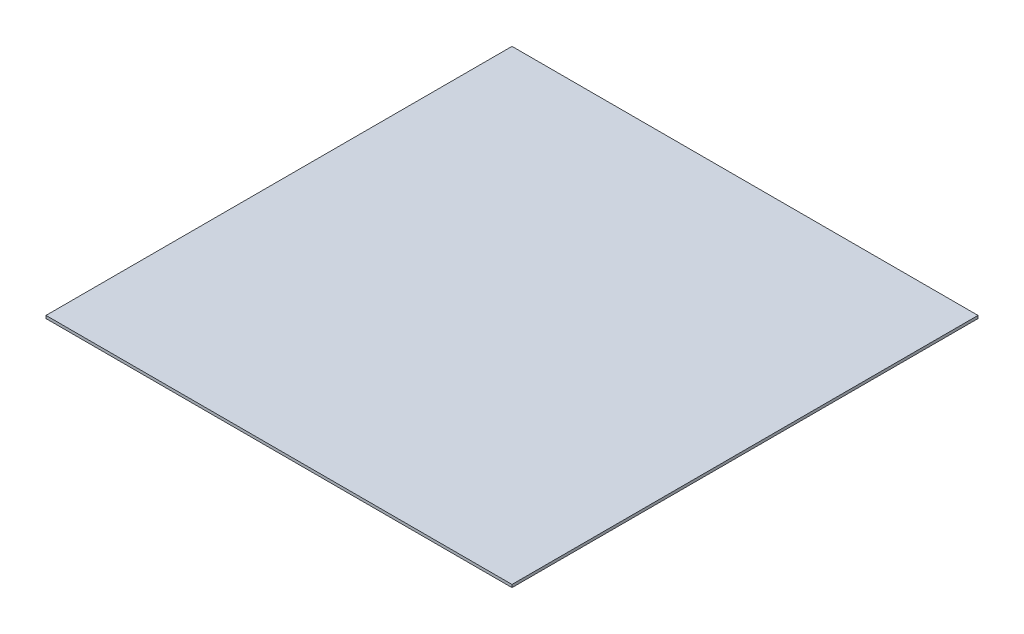
ISO-10303-21;
HEADER;
FILE_DESCRIPTION(('STEP AP214'),'2;1');
FILE_NAME('part.step','',(''),(''),'','','');
FILE_SCHEMA(('AUTOMOTIVE_DESIGN { 1 0 10303 214 1 1 1 1 }'));
ENDSEC;
DATA;
#1=APPLICATION_CONTEXT('core data for automotive mechanical design processes');
#2=APPLICATION_PROTOCOL_DEFINITION('international standard','automotive_design',2000,#1);
#3=PRODUCT_CONTEXT('',#1,'mechanical');
#4=PRODUCT('Part','Part','',(#3));
#5=PRODUCT_RELATED_PRODUCT_CATEGORY('part','',(#4));
#6=PRODUCT_DEFINITION_FORMATION('','',#4);
#7=PRODUCT_DEFINITION_CONTEXT('part definition',#1,'design');
#8=PRODUCT_DEFINITION('design','',#6,#7);
#9=PRODUCT_DEFINITION_SHAPE('','',#8);
#10=(LENGTH_UNIT() NAMED_UNIT(*) SI_UNIT(.MILLI.,.METRE.));
#11=(NAMED_UNIT(*) PLANE_ANGLE_UNIT() SI_UNIT($,.RADIAN.));
#12=(NAMED_UNIT(*) SI_UNIT($,.STERADIAN.) SOLID_ANGLE_UNIT());
#13=UNCERTAINTY_MEASURE_WITH_UNIT(LENGTH_MEASURE(1.E-05),#10,'distance_accuracy_value','');
#14=(GEOMETRIC_REPRESENTATION_CONTEXT(3) GLOBAL_UNCERTAINTY_ASSIGNED_CONTEXT((#13)) GLOBAL_UNIT_ASSIGNED_CONTEXT((#10,
#11,#12)) REPRESENTATION_CONTEXT('',''));
#15=CARTESIAN_POINT('',(0.,0.,0.));
#16=DIRECTION('',(0.,0.,1.));
#17=DIRECTION('',(1.,0.,0.));
#18=AXIS2_PLACEMENT_3D('',#15,#16,#17);
#19=CARTESIAN_POINT('',(150.,1.8,-150.));
#20=DIRECTION('',(-1.,0.,0.));
#21=DIRECTION('',(0.,0.,1.));
#22=AXIS2_PLACEMENT_3D('',#19,#20,#21);
#23=PLANE('',#22);
#24=DIRECTION('',(0.,0.,-1.));
#25=VECTOR('',#24,1.);
#26=CARTESIAN_POINT('',(150.,0.,-150.));
#27=LINE('',#26,#25);
#28=CARTESIAN_POINT('',(150.,0.,150.));
#29=VERTEX_POINT('',#28);
#30=CARTESIAN_POINT('',(150.,0.,-150.));
#31=VERTEX_POINT('',#30);
#32=EDGE_CURVE('E96',#29,#31,#27,.T.);
#33=ORIENTED_EDGE('',*,*,#32,.T.);
#34=DIRECTION('',(0.,-1.,0.));
#35=VECTOR('',#34,1.);
#36=CARTESIAN_POINT('',(150.,1.8,-150.));
#37=LINE('',#36,#35);
#38=CARTESIAN_POINT('',(150.,1.8,-150.));
#39=VERTEX_POINT('',#38);
#40=EDGE_CURVE('E11',#39,#31,#37,.T.);
#41=ORIENTED_EDGE('',*,*,#40,.F.);
#42=DIRECTION('',(0.,0.,-1.));
#43=VECTOR('',#42,1.);
#44=CARTESIAN_POINT('',(150.,1.8,-150.));
#45=LINE('',#44,#43);
#46=CARTESIAN_POINT('',(150.,1.8,150.));
#47=VERTEX_POINT('',#46);
#48=EDGE_CURVE('E84',#47,#39,#45,.T.);
#49=ORIENTED_EDGE('',*,*,#48,.F.);
#50=DIRECTION('',(0.,-1.,0.));
#51=VECTOR('',#50,1.);
#52=CARTESIAN_POINT('',(150.,1.8,150.));
#53=LINE('',#52,#51);
#54=EDGE_CURVE('E92',#47,#29,#53,.T.);
#55=ORIENTED_EDGE('',*,*,#54,.T.);
#56=EDGE_LOOP('',(#33,#41,#49,#55));
#57=FACE_BOUND('',#56,.T.);
#58=ADVANCED_FACE('F33',(#57),#23,.F.);
#59=CARTESIAN_POINT('',(-150.,1.8,-150.));
#60=DIRECTION('',(0.,0.,1.));
#61=DIRECTION('',(1.,0.,0.));
#62=AXIS2_PLACEMENT_3D('',#59,#60,#61);
#63=PLANE('',#62);
#64=DIRECTION('',(-1.,0.,0.));
#65=VECTOR('',#64,1.);
#66=CARTESIAN_POINT('',(-150.,0.,-150.));
#67=LINE('',#66,#65);
#68=CARTESIAN_POINT('',(-150.,0.,-150.));
#69=VERTEX_POINT('',#68);
#70=EDGE_CURVE('E88',#31,#69,#67,.T.);
#71=ORIENTED_EDGE('',*,*,#70,.T.);
#72=DIRECTION('',(0.,-1.,0.));
#73=VECTOR('',#72,1.);
#74=CARTESIAN_POINT('',(-150.,1.8,-150.));
#75=LINE('',#74,#73);
#76=CARTESIAN_POINT('',(-150.,1.8,-150.));
#77=VERTEX_POINT('',#76);
#78=EDGE_CURVE('E41',#77,#69,#75,.T.);
#79=ORIENTED_EDGE('',*,*,#78,.F.);
#80=DIRECTION('',(-1.,0.,0.));
#81=VECTOR('',#80,1.);
#82=CARTESIAN_POINT('',(-150.,1.8,-150.));
#83=LINE('',#82,#81);
#84=EDGE_CURVE('E79',#39,#77,#83,.T.);
#85=ORIENTED_EDGE('',*,*,#84,.F.);
#86=ORIENTED_EDGE('',*,*,#40,.T.);
#87=EDGE_LOOP('',(#71,#79,#85,#86));
#88=FACE_BOUND('',#87,.T.);
#89=ADVANCED_FACE('F87',(#88),#63,.F.);
#90=CARTESIAN_POINT('',(-150.,1.8,-150.));
#91=DIRECTION('',(1.,0.,0.));
#92=DIRECTION('',(0.,0.,-1.));
#93=AXIS2_PLACEMENT_3D('',#90,#91,#92);
#94=PLANE('',#93);
#95=DIRECTION('',(0.,0.,1.));
#96=VECTOR('',#95,1.);
#97=CARTESIAN_POINT('',(-150.,0.,-150.));
#98=LINE('',#97,#96);
#99=CARTESIAN_POINT('',(-150.,0.,150.));
#100=VERTEX_POINT('',#99);
#101=EDGE_CURVE('E66',#69,#100,#98,.T.);
#102=ORIENTED_EDGE('',*,*,#101,.T.);
#103=DIRECTION('',(0.,-1.,0.));
#104=VECTOR('',#103,1.);
#105=CARTESIAN_POINT('',(-150.,1.8,150.));
#106=LINE('',#105,#104);
#107=CARTESIAN_POINT('',(-150.,1.8,150.));
#108=VERTEX_POINT('',#107);
#109=EDGE_CURVE('E89',#108,#100,#106,.T.);
#110=ORIENTED_EDGE('',*,*,#109,.F.);
#111=DIRECTION('',(0.,0.,1.));
#112=VECTOR('',#111,1.);
#113=CARTESIAN_POINT('',(-150.,1.8,-150.));
#114=LINE('',#113,#112);
#115=EDGE_CURVE('E82',#77,#108,#114,.T.);
#116=ORIENTED_EDGE('',*,*,#115,.F.);
#117=ORIENTED_EDGE('',*,*,#78,.T.);
#118=EDGE_LOOP('',(#102,#110,#116,#117));
#119=FACE_BOUND('',#118,.T.);
#120=ADVANCED_FACE('F90',(#119),#94,.F.);
#121=CARTESIAN_POINT('',(-150.,1.8,150.));
#122=DIRECTION('',(0.,0.,-1.));
#123=DIRECTION('',(-1.,0.,0.));
#124=AXIS2_PLACEMENT_3D('',#121,#122,#123);
#125=PLANE('',#124);
#126=DIRECTION('',(1.,0.,0.));
#127=VECTOR('',#126,1.);
#128=CARTESIAN_POINT('',(-150.,0.,150.));
#129=LINE('',#128,#127);
#130=EDGE_CURVE('E72',#100,#29,#129,.T.);
#131=ORIENTED_EDGE('',*,*,#130,.T.);
#132=ORIENTED_EDGE('',*,*,#54,.F.);
#133=DIRECTION('',(1.,0.,0.));
#134=VECTOR('',#133,1.);
#135=CARTESIAN_POINT('',(-150.,1.8,150.));
#136=LINE('',#135,#134);
#137=EDGE_CURVE('E49',#108,#47,#136,.T.);
#138=ORIENTED_EDGE('',*,*,#137,.F.);
#139=ORIENTED_EDGE('',*,*,#109,.T.);
#140=EDGE_LOOP('',(#131,#132,#138,#139));
#141=FACE_BOUND('',#140,.T.);
#142=ADVANCED_FACE('F103',(#141),#125,.F.);
#143=CARTESIAN_POINT('',(0.,1.8,0.));
#144=DIRECTION('',(0.,1.,0.));
#145=DIRECTION('',(0.,0.,1.));
#146=AXIS2_PLACEMENT_3D('',#143,#144,#145);
#147=PLANE('',#146);
#148=ORIENTED_EDGE('',*,*,#48,.T.);
#149=ORIENTED_EDGE('',*,*,#84,.T.);
#150=ORIENTED_EDGE('',*,*,#115,.T.);
#151=ORIENTED_EDGE('',*,*,#137,.T.);
#152=EDGE_LOOP('',(#148,#149,#150,#151));
#153=FACE_BOUND('',#152,.T.);
#154=ADVANCED_FACE('F80',(#153),#147,.T.);
#155=CARTESIAN_POINT('',(0.,0.,0.));
#156=DIRECTION('',(0.,1.,0.));
#157=DIRECTION('',(0.,0.,1.));
#158=AXIS2_PLACEMENT_3D('',#155,#156,#157);
#159=PLANE('',#158);
#160=ORIENTED_EDGE('',*,*,#32,.F.);
#161=ORIENTED_EDGE('',*,*,#130,.F.);
#162=ORIENTED_EDGE('',*,*,#101,.F.);
#163=ORIENTED_EDGE('',*,*,#70,.F.);
#164=EDGE_LOOP('',(#160,#161,#162,#163));
#165=FACE_BOUND('',#164,.T.);
#166=ADVANCED_FACE('F106',(#165),#159,.F.);
#167=CLOSED_SHELL('',(#58,#89,#120,#142,#154,#166));
#168=MANIFOLD_SOLID_BREP('B2',#167);
#169=ADVANCED_BREP_SHAPE_REPRESENTATION('',(#18,#168),#14);
#170=SHAPE_DEFINITION_REPRESENTATION(#9,#169);
ENDSEC;
END-ISO-10303-21;
